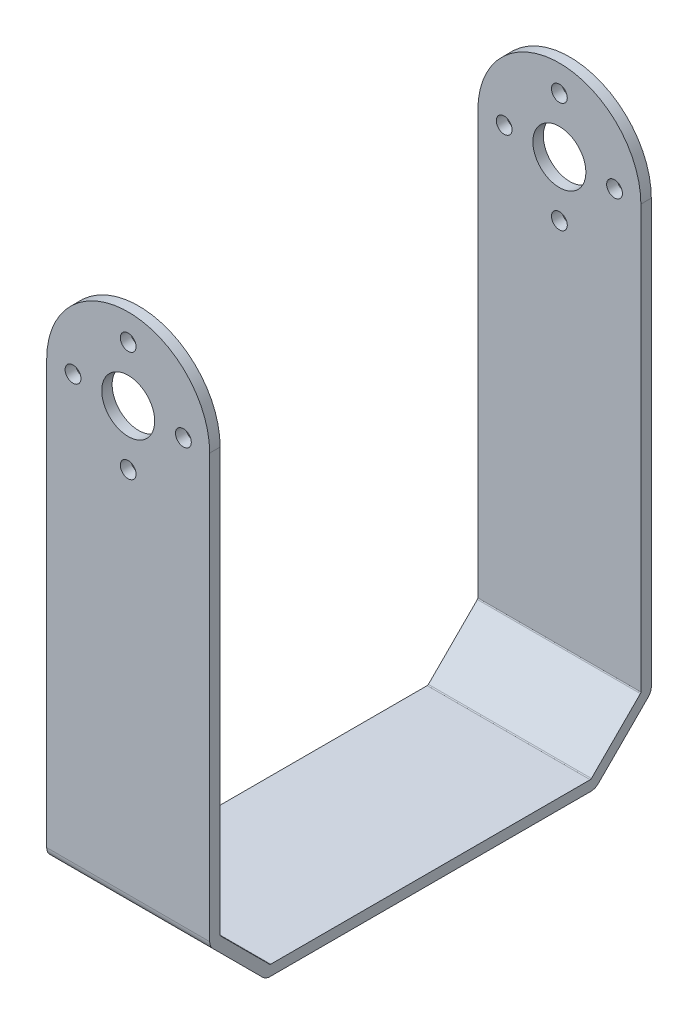
ISO-10303-21;
HEADER;
FILE_DESCRIPTION(('STEP AP214'),'2;1');
FILE_NAME('part.step','',(''),(''),'','','');
FILE_SCHEMA(('AUTOMOTIVE_DESIGN { 1 0 10303 214 1 1 1 1 }'));
ENDSEC;
DATA;
#1=APPLICATION_CONTEXT('core data for automotive mechanical design processes');
#2=APPLICATION_PROTOCOL_DEFINITION('international standard','automotive_design',2000,#1);
#3=PRODUCT_CONTEXT('',#1,'mechanical');
#4=PRODUCT('Part','Part','',(#3));
#5=PRODUCT_RELATED_PRODUCT_CATEGORY('part','',(#4));
#6=PRODUCT_DEFINITION_FORMATION('','',#4);
#7=PRODUCT_DEFINITION_CONTEXT('part definition',#1,'design');
#8=PRODUCT_DEFINITION('design','',#6,#7);
#9=PRODUCT_DEFINITION_SHAPE('','',#8);
#10=(LENGTH_UNIT() NAMED_UNIT(*) SI_UNIT(.MILLI.,.METRE.));
#11=(NAMED_UNIT(*) PLANE_ANGLE_UNIT() SI_UNIT($,.RADIAN.));
#12=(NAMED_UNIT(*) SI_UNIT($,.STERADIAN.) SOLID_ANGLE_UNIT());
#13=UNCERTAINTY_MEASURE_WITH_UNIT(LENGTH_MEASURE(1.E-05),#10,'distance_accuracy_value','');
#14=(GEOMETRIC_REPRESENTATION_CONTEXT(3) GLOBAL_UNCERTAINTY_ASSIGNED_CONTEXT((#13)) GLOBAL_UNIT_ASSIGNED_CONTEXT((#10,
#11,#12)) REPRESENTATION_CONTEXT('',''));
#15=CARTESIAN_POINT('',(0.,0.,0.));
#16=DIRECTION('',(0.,0.,1.));
#17=DIRECTION('',(1.,0.,0.));
#18=AXIS2_PLACEMENT_3D('',#15,#16,#17);
#19=CARTESIAN_POINT('',(24.6126,0.,0.));
#20=DIRECTION('',(0.,0.,-1.));
#21=DIRECTION('',(-1.,0.,0.));
#22=AXIS2_PLACEMENT_3D('',#19,#20,#21);
#23=PLANE('',#22);
#24=CARTESIAN_POINT('',(20.6375,73.025,0.));
#25=DIRECTION('',(0.,0.,1.));
#26=DIRECTION('',(1.,0.,0.));
#27=AXIS2_PLACEMENT_3D('',#24,#25,#26);
#28=CIRCLE('',#27,1.1938);
#29=CARTESIAN_POINT('',(21.8313,73.025,0.));
#30=VERTEX_POINT('',#29);
#31=EDGE_CURVE('E517',#30,#30,#28,.T.);
#32=ORIENTED_EDGE('',*,*,#31,.F.);
#33=EDGE_LOOP('',(#32));
#34=FACE_BOUND('',#33,.T.);
#35=CARTESIAN_POINT('',(12.3063,64.6938,0.));
#36=DIRECTION('',(0.,0.,1.));
#37=DIRECTION('',(1.,0.,0.));
#38=AXIS2_PLACEMENT_3D('',#35,#36,#37);
#39=CIRCLE('',#38,1.1938);
#40=CARTESIAN_POINT('',(13.5001,64.6938,0.));
#41=VERTEX_POINT('',#40);
#42=EDGE_CURVE('E420',#41,#41,#39,.T.);
#43=ORIENTED_EDGE('',*,*,#42,.F.);
#44=EDGE_LOOP('',(#43));
#45=FACE_BOUND('',#44,.T.);
#46=CARTESIAN_POINT('',(3.9751,73.025,0.));
#47=DIRECTION('',(0.,0.,1.));
#48=DIRECTION('',(1.,0.,0.));
#49=AXIS2_PLACEMENT_3D('',#46,#47,#48);
#50=CIRCLE('',#49,1.1938);
#51=CARTESIAN_POINT('',(5.1689,73.025,0.));
#52=VERTEX_POINT('',#51);
#53=EDGE_CURVE('E416',#52,#52,#50,.T.);
#54=ORIENTED_EDGE('',*,*,#53,.F.);
#55=EDGE_LOOP('',(#54));
#56=FACE_BOUND('',#55,.T.);
#57=CARTESIAN_POINT('',(12.3063,81.3562,0.));
#58=DIRECTION('',(0.,0.,1.));
#59=DIRECTION('',(1.,0.,0.));
#60=AXIS2_PLACEMENT_3D('',#57,#58,#59);
#61=CIRCLE('',#60,1.1938);
#62=CARTESIAN_POINT('',(13.5001,81.3562,0.));
#63=VERTEX_POINT('',#62);
#64=EDGE_CURVE('E440',#63,#63,#61,.T.);
#65=ORIENTED_EDGE('',*,*,#64,.F.);
#66=EDGE_LOOP('',(#65));
#67=FACE_BOUND('',#66,.T.);
#68=CARTESIAN_POINT('',(12.3063,73.025,0.));
#69=DIRECTION('',(0.,0.,1.));
#70=DIRECTION('',(1.,0.,0.));
#71=AXIS2_PLACEMENT_3D('',#68,#69,#70);
#72=CIRCLE('',#71,4.0005);
#73=CARTESIAN_POINT('',(16.3068,73.025,0.));
#74=VERTEX_POINT('',#73);
#75=EDGE_CURVE('E450',#74,#74,#72,.T.);
#76=ORIENTED_EDGE('',*,*,#75,.F.);
#77=EDGE_LOOP('',(#76));
#78=FACE_BOUND('',#77,.T.);
#79=DIRECTION('',(0.,-1.,0.));
#80=VECTOR('',#79,1.);
#81=CARTESIAN_POINT('',(0.,0.,0.));
#82=LINE('',#81,#80);
#83=CARTESIAN_POINT('',(0.,73.0123,0.));
#84=VERTEX_POINT('',#83);
#85=CARTESIAN_POINT('',(0.,9.12386051224214,0.));
#86=VERTEX_POINT('',#85);
#87=EDGE_CURVE('E249',#84,#86,#82,.T.);
#88=ORIENTED_EDGE('',*,*,#87,.T.);
#89=DIRECTION('',(1.,0.,0.));
#90=VECTOR('',#89,1.);
#91=CARTESIAN_POINT('',(24.6126,9.12386051224214,0.));
#92=LINE('',#91,#90);
#93=CARTESIAN_POINT('',(24.6126,9.12386051224214,0.));
#94=VERTEX_POINT('',#93);
#95=EDGE_CURVE('E338',#86,#94,#92,.T.);
#96=ORIENTED_EDGE('',*,*,#95,.T.);
#97=DIRECTION('',(0.,-1.,0.));
#98=VECTOR('',#97,1.);
#99=CARTESIAN_POINT('',(24.6126,0.,0.));
#100=LINE('',#99,#98);
#101=CARTESIAN_POINT('',(24.6126,73.0123,0.));
#102=VERTEX_POINT('',#101);
#103=EDGE_CURVE('E187',#102,#94,#100,.T.);
#104=ORIENTED_EDGE('',*,*,#103,.F.);
#105=CARTESIAN_POINT('',(12.3063,73.0123,0.));
#106=DIRECTION('',(0.,0.,1.));
#107=DIRECTION('',(1.,0.,0.));
#108=AXIS2_PLACEMENT_3D('',#105,#106,#107);
#109=CIRCLE('',#108,12.3063);
#110=EDGE_CURVE('E199',#102,#84,#109,.T.);
#111=ORIENTED_EDGE('',*,*,#110,.T.);
#112=EDGE_LOOP('',(#88,#96,#104,#111));
#113=FACE_BOUND('',#112,.T.);
#114=ADVANCED_FACE('F38',(#34,#45,#56,#67,#78,#113),#23,.F.);
#115=CARTESIAN_POINT('',(24.6126,0.,-66.675));
#116=DIRECTION('',(0.,0.,1.));
#117=DIRECTION('',(1.,0.,0.));
#118=AXIS2_PLACEMENT_3D('',#115,#116,#117);
#119=PLANE('',#118);
#120=CARTESIAN_POINT('',(20.6375,73.025,-66.675));
#121=DIRECTION('',(0.,0.,1.));
#122=DIRECTION('',(1.,0.,0.));
#123=AXIS2_PLACEMENT_3D('',#120,#121,#122);
#124=CIRCLE('',#123,1.1938);
#125=CARTESIAN_POINT('',(21.8313,73.025,-66.675));
#126=VERTEX_POINT('',#125);
#127=EDGE_CURVE('E513',#126,#126,#124,.T.);
#128=ORIENTED_EDGE('',*,*,#127,.T.);
#129=EDGE_LOOP('',(#128));
#130=FACE_BOUND('',#129,.T.);
#131=CARTESIAN_POINT('',(12.3063,64.6938,-66.675));
#132=DIRECTION('',(0.,0.,1.));
#133=DIRECTION('',(1.,0.,0.));
#134=AXIS2_PLACEMENT_3D('',#131,#132,#133);
#135=CIRCLE('',#134,1.1938);
#136=CARTESIAN_POINT('',(13.5001,64.6938,-66.675));
#137=VERTEX_POINT('',#136);
#138=EDGE_CURVE('E410',#137,#137,#135,.T.);
#139=ORIENTED_EDGE('',*,*,#138,.T.);
#140=EDGE_LOOP('',(#139));
#141=FACE_BOUND('',#140,.T.);
#142=CARTESIAN_POINT('',(3.9751,73.025,-66.675));
#143=DIRECTION('',(0.,0.,1.));
#144=DIRECTION('',(1.,0.,0.));
#145=AXIS2_PLACEMENT_3D('',#142,#143,#144);
#146=CIRCLE('',#145,1.1938);
#147=CARTESIAN_POINT('',(5.1689,73.025,-66.675));
#148=VERTEX_POINT('',#147);
#149=EDGE_CURVE('E405',#148,#148,#146,.T.);
#150=ORIENTED_EDGE('',*,*,#149,.T.);
#151=EDGE_LOOP('',(#150));
#152=FACE_BOUND('',#151,.T.);
#153=CARTESIAN_POINT('',(12.3063,81.3562,-66.675));
#154=DIRECTION('',(0.,0.,1.));
#155=DIRECTION('',(1.,0.,0.));
#156=AXIS2_PLACEMENT_3D('',#153,#154,#155);
#157=CIRCLE('',#156,1.1938);
#158=CARTESIAN_POINT('',(13.5001,81.3562,-66.675));
#159=VERTEX_POINT('',#158);
#160=EDGE_CURVE('E400',#159,#159,#157,.T.);
#161=ORIENTED_EDGE('',*,*,#160,.T.);
#162=EDGE_LOOP('',(#161));
#163=FACE_BOUND('',#162,.T.);
#164=CARTESIAN_POINT('',(12.3063,73.025,-66.675));
#165=DIRECTION('',(0.,0.,1.));
#166=DIRECTION('',(1.,0.,0.));
#167=AXIS2_PLACEMENT_3D('',#164,#165,#166);
#168=CIRCLE('',#167,4.0005);
#169=CARTESIAN_POINT('',(16.3068,73.025,-66.675));
#170=VERTEX_POINT('',#169);
#171=EDGE_CURVE('E394',#170,#170,#168,.T.);
#172=ORIENTED_EDGE('',*,*,#171,.T.);
#173=EDGE_LOOP('',(#172));
#174=FACE_BOUND('',#173,.T.);
#175=DIRECTION('',(0.,1.,0.));
#176=VECTOR('',#175,1.);
#177=CARTESIAN_POINT('',(24.6126,0.,-66.675));
#178=LINE('',#177,#176);
#179=CARTESIAN_POINT('',(24.6126,9.12386051224214,-66.675));
#180=VERTEX_POINT('',#179);
#181=CARTESIAN_POINT('',(24.6126,73.0123,-66.675));
#182=VERTEX_POINT('',#181);
#183=EDGE_CURVE('E281',#180,#182,#178,.T.);
#184=ORIENTED_EDGE('',*,*,#183,.F.);
#185=DIRECTION('',(1.,0.,0.));
#186=VECTOR('',#185,1.);
#187=CARTESIAN_POINT('',(0.,9.12386051224214,-66.675));
#188=LINE('',#187,#186);
#189=CARTESIAN_POINT('',(0.,9.12386051224214,-66.675));
#190=VERTEX_POINT('',#189);
#191=EDGE_CURVE('E182',#180,#190,#188,.F.);
#192=ORIENTED_EDGE('',*,*,#191,.T.);
#193=DIRECTION('',(0.,1.,0.));
#194=VECTOR('',#193,1.);
#195=CARTESIAN_POINT('',(0.,0.,-66.675));
#196=LINE('',#195,#194);
#197=CARTESIAN_POINT('',(0.,73.0123,-66.675));
#198=VERTEX_POINT('',#197);
#199=EDGE_CURVE('E176',#190,#198,#196,.T.);
#200=ORIENTED_EDGE('',*,*,#199,.T.);
#201=CARTESIAN_POINT('',(12.3063,73.0123,-66.675));
#202=DIRECTION('',(0.,0.,1.));
#203=DIRECTION('',(1.,0.,0.));
#204=AXIS2_PLACEMENT_3D('',#201,#202,#203);
#205=CIRCLE('',#204,12.3063);
#206=EDGE_CURVE('E180',#182,#198,#205,.T.);
#207=ORIENTED_EDGE('',*,*,#206,.F.);
#208=EDGE_LOOP('',(#184,#192,#200,#207));
#209=FACE_BOUND('',#208,.T.);
#210=ADVANCED_FACE('F179',(#130,#141,#152,#163,#174,#209),#119,.F.);
#211=CARTESIAN_POINT('',(0.,85.3186,-1.5748));
#212=DIRECTION('',(0.,0.,-1.));
#213=DIRECTION('',(0.,1.,0.));
#214=AXIS2_PLACEMENT_3D('',#211,#212,#213);
#215=PLANE('',#214);
#216=CARTESIAN_POINT('',(20.6375,73.025,-1.5748));
#217=DIRECTION('',(0.,0.,-1.));
#218=DIRECTION('',(0.,1.,0.));
#219=AXIS2_PLACEMENT_3D('',#216,#217,#218);
#220=CIRCLE('',#219,1.1938);
#221=CARTESIAN_POINT('',(20.6375,74.2188,-1.5748));
#222=VERTEX_POINT('',#221);
#223=EDGE_CURVE('E426',#222,#222,#220,.T.);
#224=ORIENTED_EDGE('',*,*,#223,.F.);
#225=EDGE_LOOP('',(#224));
#226=FACE_BOUND('',#225,.T.);
#227=CARTESIAN_POINT('',(12.3063,64.6938,-1.5748));
#228=DIRECTION('',(0.,0.,-1.));
#229=DIRECTION('',(0.,1.,0.));
#230=AXIS2_PLACEMENT_3D('',#227,#228,#229);
#231=CIRCLE('',#230,1.1938);
#232=CARTESIAN_POINT('',(12.3063,65.8876,-1.5748));
#233=VERTEX_POINT('',#232);
#234=EDGE_CURVE('E409',#233,#233,#231,.T.);
#235=ORIENTED_EDGE('',*,*,#234,.F.);
#236=EDGE_LOOP('',(#235));
#237=FACE_BOUND('',#236,.T.);
#238=CARTESIAN_POINT('',(3.9751,73.025,-1.5748));
#239=DIRECTION('',(0.,0.,-1.));
#240=DIRECTION('',(0.,1.,0.));
#241=AXIS2_PLACEMENT_3D('',#238,#239,#240);
#242=CIRCLE('',#241,1.1938);
#243=CARTESIAN_POINT('',(3.9751,74.2188,-1.5748));
#244=VERTEX_POINT('',#243);
#245=EDGE_CURVE('E404',#244,#244,#242,.T.);
#246=ORIENTED_EDGE('',*,*,#245,.F.);
#247=EDGE_LOOP('',(#246));
#248=FACE_BOUND('',#247,.T.);
#249=CARTESIAN_POINT('',(12.3063,81.3562,-1.5748));
#250=DIRECTION('',(0.,0.,-1.));
#251=DIRECTION('',(0.,1.,0.));
#252=AXIS2_PLACEMENT_3D('',#249,#250,#251);
#253=CIRCLE('',#252,1.1938);
#254=CARTESIAN_POINT('',(12.3063,82.55,-1.5748));
#255=VERTEX_POINT('',#254);
#256=EDGE_CURVE('E399',#255,#255,#253,.T.);
#257=ORIENTED_EDGE('',*,*,#256,.F.);
#258=EDGE_LOOP('',(#257));
#259=FACE_BOUND('',#258,.T.);
#260=CARTESIAN_POINT('',(12.3063,73.025,-1.5748));
#261=DIRECTION('',(0.,0.,-1.));
#262=DIRECTION('',(0.,1.,0.));
#263=AXIS2_PLACEMENT_3D('',#260,#261,#262);
#264=CIRCLE('',#263,4.0005);
#265=CARTESIAN_POINT('',(12.3063,77.0255,-1.5748));
#266=VERTEX_POINT('',#265);
#267=EDGE_CURVE('E393',#266,#266,#264,.T.);
#268=ORIENTED_EDGE('',*,*,#267,.F.);
#269=EDGE_LOOP('',(#268));
#270=FACE_BOUND('',#269,.T.);
#271=DIRECTION('',(0.,1.,0.));
#272=VECTOR('',#271,1.);
#273=CARTESIAN_POINT('',(24.6126,85.3186,-1.5748));
#274=LINE('',#273,#272);
#275=CARTESIAN_POINT('',(24.6126,9.22381024484277,-1.57480000000001));
#276=VERTEX_POINT('',#275);
#277=CARTESIAN_POINT('',(24.6126,73.0123,-1.5748));
#278=VERTEX_POINT('',#277);
#279=EDGE_CURVE('E228',#276,#278,#274,.T.);
#280=ORIENTED_EDGE('',*,*,#279,.F.);
#281=DIRECTION('',(1.,0.,0.));
#282=VECTOR('',#281,1.);
#283=CARTESIAN_POINT('',(0.,9.22381024484277,-1.57480000000001));
#284=LINE('',#283,#282);
#285=CARTESIAN_POINT('',(0.,9.22381024484277,-1.57480000000001));
#286=VERTEX_POINT('',#285);
#287=EDGE_CURVE('E62',#276,#286,#284,.F.);
#288=ORIENTED_EDGE('',*,*,#287,.T.);
#289=DIRECTION('',(0.,1.,0.));
#290=VECTOR('',#289,1.);
#291=CARTESIAN_POINT('',(0.,85.3186,-1.5748));
#292=LINE('',#291,#290);
#293=CARTESIAN_POINT('',(0.,73.0123,-1.5748));
#294=VERTEX_POINT('',#293);
#295=EDGE_CURVE('E246',#286,#294,#292,.T.);
#296=ORIENTED_EDGE('',*,*,#295,.T.);
#297=CARTESIAN_POINT('',(12.3063,73.0123,-1.5748));
#298=DIRECTION('',(0.,0.,-1.));
#299=DIRECTION('',(0.,1.,0.));
#300=AXIS2_PLACEMENT_3D('',#297,#298,#299);
#301=CIRCLE('',#300,12.3063);
#302=EDGE_CURVE('E218',#294,#278,#301,.T.);
#303=ORIENTED_EDGE('',*,*,#302,.T.);
#304=EDGE_LOOP('',(#280,#288,#296,#303));
#305=FACE_BOUND('',#304,.T.);
#306=ADVANCED_FACE('F475',(#226,#237,#248,#259,#270,#305),#215,.T.);
#307=CARTESIAN_POINT('',(0.,9.1186,-65.1002));
#308=DIRECTION('',(0.,0.,1.));
#309=DIRECTION('',(1.,0.,0.));
#310=AXIS2_PLACEMENT_3D('',#307,#308,#309);
#311=PLANE('',#310);
#312=CARTESIAN_POINT('',(20.6375,73.025,-65.1002));
#313=DIRECTION('',(0.,0.,1.));
#314=DIRECTION('',(1.,0.,0.));
#315=AXIS2_PLACEMENT_3D('',#312,#313,#314);
#316=CIRCLE('',#315,1.1938);
#317=CARTESIAN_POINT('',(21.8313,73.025,-65.1002));
#318=VERTEX_POINT('',#317);
#319=EDGE_CURVE('E42',#318,#318,#316,.T.);
#320=ORIENTED_EDGE('',*,*,#319,.F.);
#321=EDGE_LOOP('',(#320));
#322=FACE_BOUND('',#321,.T.);
#323=CARTESIAN_POINT('',(12.3063,64.6938,-65.1002));
#324=DIRECTION('',(0.,0.,1.));
#325=DIRECTION('',(1.,0.,0.));
#326=AXIS2_PLACEMENT_3D('',#323,#324,#325);
#327=CIRCLE('',#326,1.1938);
#328=CARTESIAN_POINT('',(13.5001,64.6938,-65.1002));
#329=VERTEX_POINT('',#328);
#330=EDGE_CURVE('E406',#329,#329,#327,.T.);
#331=ORIENTED_EDGE('',*,*,#330,.F.);
#332=EDGE_LOOP('',(#331));
#333=FACE_BOUND('',#332,.T.);
#334=CARTESIAN_POINT('',(3.9751,73.025,-65.1002));
#335=DIRECTION('',(0.,0.,1.));
#336=DIRECTION('',(1.,0.,0.));
#337=AXIS2_PLACEMENT_3D('',#334,#335,#336);
#338=CIRCLE('',#337,1.1938);
#339=CARTESIAN_POINT('',(5.1689,73.025,-65.1002));
#340=VERTEX_POINT('',#339);
#341=EDGE_CURVE('E401',#340,#340,#338,.T.);
#342=ORIENTED_EDGE('',*,*,#341,.F.);
#343=EDGE_LOOP('',(#342));
#344=FACE_BOUND('',#343,.T.);
#345=CARTESIAN_POINT('',(12.3063,81.3562,-65.1002));
#346=DIRECTION('',(0.,0.,1.));
#347=DIRECTION('',(1.,0.,0.));
#348=AXIS2_PLACEMENT_3D('',#345,#346,#347);
#349=CIRCLE('',#348,1.1938);
#350=CARTESIAN_POINT('',(13.5001,81.3562,-65.1002));
#351=VERTEX_POINT('',#350);
#352=EDGE_CURVE('E395',#351,#351,#349,.T.);
#353=ORIENTED_EDGE('',*,*,#352,.F.);
#354=EDGE_LOOP('',(#353));
#355=FACE_BOUND('',#354,.T.);
#356=CARTESIAN_POINT('',(12.3063,73.025,-65.1002));
#357=DIRECTION('',(0.,0.,1.));
#358=DIRECTION('',(1.,0.,0.));
#359=AXIS2_PLACEMENT_3D('',#356,#357,#358);
#360=CIRCLE('',#359,4.0005);
#361=CARTESIAN_POINT('',(16.3068,73.025,-65.1002));
#362=VERTEX_POINT('',#361);
#363=EDGE_CURVE('E389',#362,#362,#360,.T.);
#364=ORIENTED_EDGE('',*,*,#363,.F.);
#365=EDGE_LOOP('',(#364));
#366=FACE_BOUND('',#365,.T.);
#367=DIRECTION('',(0.,-1.,0.));
#368=VECTOR('',#367,1.);
#369=CARTESIAN_POINT('',(0.,9.1186,-65.1002));
#370=LINE('',#369,#368);
#371=CARTESIAN_POINT('',(0.,73.0123,-65.1002));
#372=VERTEX_POINT('',#371);
#373=CARTESIAN_POINT('',(0.,9.22381024484276,-65.1002));
#374=VERTEX_POINT('',#373);
#375=EDGE_CURVE('E205',#372,#374,#370,.T.);
#376=ORIENTED_EDGE('',*,*,#375,.T.);
#377=DIRECTION('',(1.,0.,0.));
#378=VECTOR('',#377,1.);
#379=CARTESIAN_POINT('',(24.6126,9.22381024484276,-65.1002));
#380=LINE('',#379,#378);
#381=CARTESIAN_POINT('',(24.6126,9.22381024484276,-65.1002));
#382=VERTEX_POINT('',#381);
#383=EDGE_CURVE('E342',#374,#382,#380,.T.);
#384=ORIENTED_EDGE('',*,*,#383,.T.);
#385=DIRECTION('',(0.,-1.,0.));
#386=VECTOR('',#385,1.);
#387=CARTESIAN_POINT('',(24.6126,9.1186,-65.1002));
#388=LINE('',#387,#386);
#389=CARTESIAN_POINT('',(24.6126,73.0123,-65.1002));
#390=VERTEX_POINT('',#389);
#391=EDGE_CURVE('E257',#390,#382,#388,.T.);
#392=ORIENTED_EDGE('',*,*,#391,.F.);
#393=CARTESIAN_POINT('',(12.3063,73.0123,-65.1002));
#394=DIRECTION('',(0.,0.,1.));
#395=DIRECTION('',(1.,0.,0.));
#396=AXIS2_PLACEMENT_3D('',#393,#394,#395);
#397=CIRCLE('',#396,12.3063);
#398=EDGE_CURVE('E284',#390,#372,#397,.T.);
#399=ORIENTED_EDGE('',*,*,#398,.T.);
#400=EDGE_LOOP('',(#376,#384,#392,#399));
#401=FACE_BOUND('',#400,.T.);
#402=ADVANCED_FACE('F508',(#322,#333,#344,#355,#366,#401),#311,.T.);
#403=CARTESIAN_POINT('',(24.6126,0.,0.));
#404=DIRECTION('',(0.,1.,0.));
#405=DIRECTION('',(0.,0.,1.));
#406=AXIS2_PLACEMENT_3D('',#403,#404,#405);
#407=PLANE('',#406);
#408=DIRECTION('',(0.,0.,-1.));
#409=VECTOR('',#408,1.);
#410=CARTESIAN_POINT('',(0.,0.,0.));
#411=LINE('',#410,#409);
#412=CARTESIAN_POINT('',(0.,0.,-9.12386051224214));
#413=VERTEX_POINT('',#412);
#414=CARTESIAN_POINT('',(0.,0.,-57.5511394877579));
#415=VERTEX_POINT('',#414);
#416=EDGE_CURVE('E188',#413,#415,#411,.T.);
#417=ORIENTED_EDGE('',*,*,#416,.T.);
#418=DIRECTION('',(1.,0.,0.));
#419=VECTOR('',#418,1.);
#420=CARTESIAN_POINT('',(24.6126,0.,-57.5511394877579));
#421=LINE('',#420,#419);
#422=CARTESIAN_POINT('',(24.6126,0.,-57.5511394877579));
#423=VERTEX_POINT('',#422);
#424=EDGE_CURVE('E296',#415,#423,#421,.T.);
#425=ORIENTED_EDGE('',*,*,#424,.T.);
#426=DIRECTION('',(0.,0.,-1.));
#427=VECTOR('',#426,1.);
#428=CARTESIAN_POINT('',(24.6126,0.,0.));
#429=LINE('',#428,#427);
#430=CARTESIAN_POINT('',(24.6126,0.,-9.12386051224214));
#431=VERTEX_POINT('',#430);
#432=EDGE_CURVE('E277',#431,#423,#429,.T.);
#433=ORIENTED_EDGE('',*,*,#432,.F.);
#434=DIRECTION('',(1.,0.,0.));
#435=VECTOR('',#434,1.);
#436=CARTESIAN_POINT('',(0.,0.,-9.12386051224214));
#437=LINE('',#436,#435);
#438=EDGE_CURVE('E293',#431,#413,#437,.F.);
#439=ORIENTED_EDGE('',*,*,#438,.T.);
#440=EDGE_LOOP('',(#417,#425,#433,#439));
#441=FACE_BOUND('',#440,.T.);
#442=ADVANCED_FACE('F567',(#441),#407,.F.);
#443=CARTESIAN_POINT('',(24.6126,85.3186,0.));
#444=DIRECTION('',(-1.,0.,0.));
#445=DIRECTION('',(0.,0.,1.));
#446=AXIS2_PLACEMENT_3D('',#443,#444,#445);
#447=PLANE('',#446);
#448=ORIENTED_EDGE('',*,*,#432,.T.);
#449=CARTESIAN_POINT('',(24.6126,1.5875,-57.5511394877579));
#450=DIRECTION('',(-1.,0.,0.));
#451=DIRECTION('',(0.,0.,1.));
#452=AXIS2_PLACEMENT_3D('',#449,#450,#451);
#453=CIRCLE('',#452,1.5875);
#454=CARTESIAN_POINT('',(24.6126,0.464967984866358,-58.6736715028915));
#455=VERTEX_POINT('',#454);
#456=EDGE_CURVE('E308',#423,#455,#453,.F.);
#457=ORIENTED_EDGE('',*,*,#456,.T.);
#458=DIRECTION('',(0.,0.707106781186548,-0.707106781186547));
#459=VECTOR('',#458,1.);
#460=CARTESIAN_POINT('',(24.6126,0.,-58.2087035180252));
#461=LINE('',#460,#459);
#462=CARTESIAN_POINT('',(24.6126,8.00132849710849,-66.2100320151336));
#463=VERTEX_POINT('',#462);
#464=EDGE_CURVE('E253',#455,#463,#461,.T.);
#465=ORIENTED_EDGE('',*,*,#464,.T.);
#466=CARTESIAN_POINT('',(24.6126,9.12386051224214,-65.0875));
#467=DIRECTION('',(-1.,0.,0.));
#468=DIRECTION('',(0.,0.,1.));
#469=AXIS2_PLACEMENT_3D('',#466,#467,#468);
#470=CIRCLE('',#469,1.5875);
#471=EDGE_CURVE('E305',#463,#180,#470,.F.);
#472=ORIENTED_EDGE('',*,*,#471,.T.);
#473=ORIENTED_EDGE('',*,*,#183,.T.);
#474=DIRECTION('',(0.,0.,1.));
#475=VECTOR('',#474,1.);
#476=CARTESIAN_POINT('',(24.6126,73.0123,-66.675));
#477=LINE('',#476,#475);
#478=EDGE_CURVE('E196',#182,#390,#477,.T.);
#479=ORIENTED_EDGE('',*,*,#478,.T.);
#480=ORIENTED_EDGE('',*,*,#391,.T.);
#481=CARTESIAN_POINT('',(24.6126,9.22381024484276,-64.8462));
#482=DIRECTION('',(-1.,0.,0.));
#483=DIRECTION('',(0.,0.,1.));
#484=AXIS2_PLACEMENT_3D('',#481,#482,#483);
#485=CIRCLE('',#484,0.254);
#486=CARTESIAN_POINT('',(24.6126,9.04420512242137,-65.0258051224214));
#487=VERTEX_POINT('',#486);
#488=EDGE_CURVE('E369',#382,#487,#485,.T.);
#489=ORIENTED_EDGE('',*,*,#488,.T.);
#490=DIRECTION('',(0.,-0.707106781186548,0.707106781186547));
#491=VECTOR('',#490,1.);
#492=CARTESIAN_POINT('',(24.6126,9.1186,-65.1002));
#493=LINE('',#492,#491);
#494=CARTESIAN_POINT('',(24.6126,1.64919487757862,-57.6307948775786));
#495=VERTEX_POINT('',#494);
#496=EDGE_CURVE('E261',#487,#495,#493,.T.);
#497=ORIENTED_EDGE('',*,*,#496,.T.);
#498=CARTESIAN_POINT('',(24.6126,1.8288,-57.4511897551572));
#499=DIRECTION('',(-1.,0.,0.));
#500=DIRECTION('',(0.,0.,1.));
#501=AXIS2_PLACEMENT_3D('',#498,#499,#500);
#502=CIRCLE('',#501,0.254);
#503=CARTESIAN_POINT('',(24.6126,1.5748,-57.4511897551572));
#504=VERTEX_POINT('',#503);
#505=EDGE_CURVE('E375',#495,#504,#502,.T.);
#506=ORIENTED_EDGE('',*,*,#505,.T.);
#507=DIRECTION('',(0.,0.,1.));
#508=VECTOR('',#507,1.);
#509=CARTESIAN_POINT('',(24.6126,1.5748,-9.1186));
#510=LINE('',#509,#508);
#511=CARTESIAN_POINT('',(24.6126,1.5748,-9.22381024484277));
#512=VERTEX_POINT('',#511);
#513=EDGE_CURVE('E265',#504,#512,#510,.T.);
#514=ORIENTED_EDGE('',*,*,#513,.T.);
#515=CARTESIAN_POINT('',(24.6126,1.8288,-9.22381024484277));
#516=DIRECTION('',(-1.,0.,0.));
#517=DIRECTION('',(0.,0.,1.));
#518=AXIS2_PLACEMENT_3D('',#515,#516,#517);
#519=CIRCLE('',#518,0.254);
#520=CARTESIAN_POINT('',(24.6126,1.64919487757862,-9.04420512242138));
#521=VERTEX_POINT('',#520);
#522=EDGE_CURVE('E381',#512,#521,#519,.T.);
#523=ORIENTED_EDGE('',*,*,#522,.T.);
#524=DIRECTION('',(0.,0.707106781186548,0.707106781186547));
#525=VECTOR('',#524,1.);
#526=CARTESIAN_POINT('',(24.6126,9.1186,-1.57480000000001));
#527=LINE('',#526,#525);
#528=CARTESIAN_POINT('',(24.6126,9.04420512242138,-1.64919487757862));
#529=VERTEX_POINT('',#528);
#530=EDGE_CURVE('E269',#521,#529,#527,.T.);
#531=ORIENTED_EDGE('',*,*,#530,.T.);
#532=CARTESIAN_POINT('',(24.6126,9.22381024484277,-1.82880000000001));
#533=DIRECTION('',(-1.,0.,0.));
#534=DIRECTION('',(0.,0.,1.));
#535=AXIS2_PLACEMENT_3D('',#532,#533,#534);
#536=CIRCLE('',#535,0.254);
#537=EDGE_CURVE('E48',#529,#276,#536,.T.);
#538=ORIENTED_EDGE('',*,*,#537,.T.);
#539=ORIENTED_EDGE('',*,*,#279,.T.);
#540=EDGE_CURVE('E207',#278,#102,#477,.T.);
#541=ORIENTED_EDGE('',*,*,#540,.T.);
#542=ORIENTED_EDGE('',*,*,#103,.T.);
#543=CARTESIAN_POINT('',(24.6126,9.12386051224214,-1.5875));
#544=DIRECTION('',(-1.,0.,0.));
#545=DIRECTION('',(0.,0.,1.));
#546=AXIS2_PLACEMENT_3D('',#543,#544,#545);
#547=CIRCLE('',#546,1.5875);
#548=CARTESIAN_POINT('',(24.6126,8.00132849710849,-0.464967984866355));
#549=VERTEX_POINT('',#548);
#550=EDGE_CURVE('E300',#94,#549,#547,.F.);
#551=ORIENTED_EDGE('',*,*,#550,.T.);
#552=DIRECTION('',(0.,-0.707106781186547,-0.707106781186548));
#553=VECTOR('',#552,1.);
#554=CARTESIAN_POINT('',(24.6126,8.46629648197485,0.));
#555=LINE('',#554,#553);
#556=CARTESIAN_POINT('',(24.6126,0.464967984866357,-8.00132849710849));
#557=VERTEX_POINT('',#556);
#558=EDGE_CURVE('E222',#549,#557,#555,.T.);
#559=ORIENTED_EDGE('',*,*,#558,.T.);
#560=CARTESIAN_POINT('',(24.6126,1.5875,-9.12386051224214));
#561=DIRECTION('',(-1.,0.,0.));
#562=DIRECTION('',(0.,0.,1.));
#563=AXIS2_PLACEMENT_3D('',#560,#561,#562);
#564=CIRCLE('',#563,1.5875);
#565=EDGE_CURVE('E303',#557,#431,#564,.F.);
#566=ORIENTED_EDGE('',*,*,#565,.T.);
#567=EDGE_LOOP('',(#448,#457,#465,#472,#473,#479,#480,#489,#497,#506,#514,#523,#531,#538,#539,
#541,#542,#551,#559,#566));
#568=FACE_BOUND('',#567,.T.);
#569=ADVANCED_FACE('F473',(#568),#447,.F.);
#570=CARTESIAN_POINT('',(0.,85.3186,0.));
#571=DIRECTION('',(-1.,0.,0.));
#572=DIRECTION('',(0.,0.,1.));
#573=AXIS2_PLACEMENT_3D('',#570,#571,#572);
#574=PLANE('',#573);
#575=DIRECTION('',(0.,0.707106781186548,-0.707106781186547));
#576=VECTOR('',#575,1.);
#577=CARTESIAN_POINT('',(0.,0.,-58.2087035180252));
#578=LINE('',#577,#576);
#579=CARTESIAN_POINT('',(0.,0.464967984866358,-58.6736715028915));
#580=VERTEX_POINT('',#579);
#581=CARTESIAN_POINT('',(0.,8.00132849710849,-66.2100320151336));
#582=VERTEX_POINT('',#581);
#583=EDGE_CURVE('E227',#580,#582,#578,.T.);
#584=ORIENTED_EDGE('',*,*,#583,.F.);
#585=CARTESIAN_POINT('',(0.,1.5875,-57.5511394877579));
#586=DIRECTION('',(-1.,0.,0.));
#587=DIRECTION('',(0.,0.,1.));
#588=AXIS2_PLACEMENT_3D('',#585,#586,#587);
#589=CIRCLE('',#588,1.5875);
#590=EDGE_CURVE('E327',#580,#415,#589,.T.);
#591=ORIENTED_EDGE('',*,*,#590,.T.);
#592=ORIENTED_EDGE('',*,*,#416,.F.);
#593=CARTESIAN_POINT('',(0.,1.5875,-9.12386051224214));
#594=DIRECTION('',(-1.,0.,0.));
#595=DIRECTION('',(0.,0.,1.));
#596=AXIS2_PLACEMENT_3D('',#593,#594,#595);
#597=CIRCLE('',#596,1.5875);
#598=CARTESIAN_POINT('',(0.,0.464967984866357,-8.00132849710849));
#599=VERTEX_POINT('',#598);
#600=EDGE_CURVE('E321',#413,#599,#597,.T.);
#601=ORIENTED_EDGE('',*,*,#600,.T.);
#602=DIRECTION('',(0.,-0.707106781186547,-0.707106781186548));
#603=VECTOR('',#602,1.);
#604=CARTESIAN_POINT('',(0.,8.46629648197485,0.));
#605=LINE('',#604,#603);
#606=CARTESIAN_POINT('',(0.,8.00132849710849,-0.464967984866355));
#607=VERTEX_POINT('',#606);
#608=EDGE_CURVE('E223',#607,#599,#605,.T.);
#609=ORIENTED_EDGE('',*,*,#608,.F.);
#610=CARTESIAN_POINT('',(0.,9.12386051224214,-1.5875));
#611=DIRECTION('',(-1.,0.,0.));
#612=DIRECTION('',(0.,0.,1.));
#613=AXIS2_PLACEMENT_3D('',#610,#611,#612);
#614=CIRCLE('',#613,1.5875);
#615=EDGE_CURVE('E318',#607,#86,#614,.T.);
#616=ORIENTED_EDGE('',*,*,#615,.T.);
#617=ORIENTED_EDGE('',*,*,#87,.F.);
#618=DIRECTION('',(0.,0.,1.));
#619=VECTOR('',#618,1.);
#620=CARTESIAN_POINT('',(0.,73.0123,-66.675));
#621=LINE('',#620,#619);
#622=EDGE_CURVE('E198',#294,#84,#621,.T.);
#623=ORIENTED_EDGE('',*,*,#622,.F.);
#624=ORIENTED_EDGE('',*,*,#295,.F.);
#625=CARTESIAN_POINT('',(0.,9.22381024484277,-1.82880000000001));
#626=DIRECTION('',(-1.,0.,0.));
#627=DIRECTION('',(0.,0.,1.));
#628=AXIS2_PLACEMENT_3D('',#625,#626,#627);
#629=CIRCLE('',#628,0.254);
#630=CARTESIAN_POINT('',(0.,9.04420512242138,-1.64919487757862));
#631=VERTEX_POINT('',#630);
#632=EDGE_CURVE('E12',#286,#631,#629,.F.);
#633=ORIENTED_EDGE('',*,*,#632,.T.);
#634=DIRECTION('',(0.,0.707106781186548,0.707106781186547));
#635=VECTOR('',#634,1.);
#636=CARTESIAN_POINT('',(0.,9.1186,-1.57480000000001));
#637=LINE('',#636,#635);
#638=CARTESIAN_POINT('',(0.,1.64919487757862,-9.04420512242138));
#639=VERTEX_POINT('',#638);
#640=EDGE_CURVE('E242',#639,#631,#637,.T.);
#641=ORIENTED_EDGE('',*,*,#640,.F.);
#642=CARTESIAN_POINT('',(0.,1.8288,-9.22381024484277));
#643=DIRECTION('',(-1.,0.,0.));
#644=DIRECTION('',(0.,0.,1.));
#645=AXIS2_PLACEMENT_3D('',#642,#643,#644);
#646=CIRCLE('',#645,0.254);
#647=CARTESIAN_POINT('',(0.,1.5748,-9.22381024484277));
#648=VERTEX_POINT('',#647);
#649=EDGE_CURVE('E384',#639,#648,#646,.F.);
#650=ORIENTED_EDGE('',*,*,#649,.T.);
#651=DIRECTION('',(0.,0.,1.));
#652=VECTOR('',#651,1.);
#653=CARTESIAN_POINT('',(0.,1.5748,-9.1186));
#654=LINE('',#653,#652);
#655=CARTESIAN_POINT('',(0.,1.5748,-57.4511897551572));
#656=VERTEX_POINT('',#655);
#657=EDGE_CURVE('E238',#656,#648,#654,.T.);
#658=ORIENTED_EDGE('',*,*,#657,.F.);
#659=CARTESIAN_POINT('',(0.,1.8288,-57.4511897551572));
#660=DIRECTION('',(-1.,0.,0.));
#661=DIRECTION('',(0.,0.,1.));
#662=AXIS2_PLACEMENT_3D('',#659,#660,#661);
#663=CIRCLE('',#662,0.254);
#664=CARTESIAN_POINT('',(0.,1.64919487757862,-57.6307948775786));
#665=VERTEX_POINT('',#664);
#666=EDGE_CURVE('E378',#656,#665,#663,.F.);
#667=ORIENTED_EDGE('',*,*,#666,.T.);
#668=DIRECTION('',(0.,-0.707106781186548,0.707106781186547));
#669=VECTOR('',#668,1.);
#670=CARTESIAN_POINT('',(0.,9.1186,-65.1002));
#671=LINE('',#670,#669);
#672=CARTESIAN_POINT('',(0.,9.04420512242137,-65.0258051224214));
#673=VERTEX_POINT('',#672);
#674=EDGE_CURVE('E234',#673,#665,#671,.T.);
#675=ORIENTED_EDGE('',*,*,#674,.F.);
#676=CARTESIAN_POINT('',(0.,9.22381024484276,-64.8462));
#677=DIRECTION('',(-1.,0.,0.));
#678=DIRECTION('',(0.,0.,1.));
#679=AXIS2_PLACEMENT_3D('',#676,#677,#678);
#680=CIRCLE('',#679,0.254);
#681=EDGE_CURVE('E372',#673,#374,#680,.F.);
#682=ORIENTED_EDGE('',*,*,#681,.T.);
#683=ORIENTED_EDGE('',*,*,#375,.F.);
#684=EDGE_CURVE('E193',#198,#372,#621,.T.);
#685=ORIENTED_EDGE('',*,*,#684,.F.);
#686=ORIENTED_EDGE('',*,*,#199,.F.);
#687=CARTESIAN_POINT('',(0.,9.12386051224214,-65.0875));
#688=DIRECTION('',(-1.,0.,0.));
#689=DIRECTION('',(0.,0.,1.));
#690=AXIS2_PLACEMENT_3D('',#687,#688,#689);
#691=CIRCLE('',#690,1.5875);
#692=EDGE_CURVE('E324',#190,#582,#691,.T.);
#693=ORIENTED_EDGE('',*,*,#692,.T.);
#694=EDGE_LOOP('',(#584,#591,#592,#601,#609,#616,#617,#623,#624,#633,#641,#650,#658,#667,#675,
#682,#683,#685,#686,#693));
#695=FACE_BOUND('',#694,.T.);
#696=ADVANCED_FACE('F203',(#695),#574,.T.);
#697=CARTESIAN_POINT('',(0.,8.46629648197485,0.));
#698=DIRECTION('',(0.,-0.707106781186548,0.707106781186547));
#699=DIRECTION('',(0.,-0.707106781186547,-0.707106781186548));
#700=AXIS2_PLACEMENT_3D('',#697,#698,#699);
#701=PLANE('',#700);
#702=ORIENTED_EDGE('',*,*,#608,.T.);
#703=DIRECTION('',(1.,0.,0.));
#704=VECTOR('',#703,1.);
#705=CARTESIAN_POINT('',(24.6126,0.464967984866357,-8.0013284971085));
#706=LINE('',#705,#704);
#707=EDGE_CURVE('E335',#599,#557,#706,.T.);
#708=ORIENTED_EDGE('',*,*,#707,.T.);
#709=ORIENTED_EDGE('',*,*,#558,.F.);
#710=DIRECTION('',(1.,0.,0.));
#711=VECTOR('',#710,1.);
#712=CARTESIAN_POINT('',(0.,8.00132849710849,-0.464967984866355));
#713=LINE('',#712,#711);
#714=EDGE_CURVE('E332',#549,#607,#713,.F.);
#715=ORIENTED_EDGE('',*,*,#714,.T.);
#716=EDGE_LOOP('',(#702,#708,#709,#715));
#717=FACE_BOUND('',#716,.T.);
#718=ADVANCED_FACE('F571',(#717),#701,.T.);
#719=CARTESIAN_POINT('',(0.,0.,-58.2087035180252));
#720=DIRECTION('',(0.,-0.707106781186547,-0.707106781186548));
#721=DIRECTION('',(0.,0.707106781186548,-0.707106781186547));
#722=AXIS2_PLACEMENT_3D('',#719,#720,#721);
#723=PLANE('',#722);
#724=ORIENTED_EDGE('',*,*,#464,.F.);
#725=DIRECTION('',(1.,0.,0.));
#726=VECTOR('',#725,1.);
#727=CARTESIAN_POINT('',(0.,0.464967984866357,-58.6736715028915));
#728=LINE('',#727,#726);
#729=EDGE_CURVE('E315',#455,#580,#728,.F.);
#730=ORIENTED_EDGE('',*,*,#729,.T.);
#731=ORIENTED_EDGE('',*,*,#583,.T.);
#732=DIRECTION('',(1.,0.,0.));
#733=VECTOR('',#732,1.);
#734=CARTESIAN_POINT('',(24.6126,8.00132849710849,-66.2100320151336));
#735=LINE('',#734,#733);
#736=EDGE_CURVE('E311',#582,#463,#735,.T.);
#737=ORIENTED_EDGE('',*,*,#736,.T.);
#738=EDGE_LOOP('',(#724,#730,#731,#737));
#739=FACE_BOUND('',#738,.T.);
#740=ADVANCED_FACE('F560',(#739),#723,.T.);
#741=CARTESIAN_POINT('',(0.,9.1186,-1.57480000000001));
#742=DIRECTION('',(0.,0.707106781186547,-0.707106781186548));
#743=DIRECTION('',(0.,0.707106781186548,0.707106781186547));
#744=AXIS2_PLACEMENT_3D('',#741,#742,#743);
#745=PLANE('',#744);
#746=ORIENTED_EDGE('',*,*,#530,.F.);
#747=DIRECTION('',(1.,0.,0.));
#748=VECTOR('',#747,1.);
#749=CARTESIAN_POINT('',(0.,1.64919487757862,-9.04420512242138));
#750=LINE('',#749,#748);
#751=EDGE_CURVE('E364',#521,#639,#750,.F.);
#752=ORIENTED_EDGE('',*,*,#751,.T.);
#753=ORIENTED_EDGE('',*,*,#640,.T.);
#754=DIRECTION('',(1.,0.,0.));
#755=VECTOR('',#754,1.);
#756=CARTESIAN_POINT('',(24.6126,9.04420512242138,-1.64919487757862));
#757=LINE('',#756,#755);
#758=EDGE_CURVE('E360',#631,#529,#757,.T.);
#759=ORIENTED_EDGE('',*,*,#758,.T.);
#760=EDGE_LOOP('',(#746,#752,#753,#759));
#761=FACE_BOUND('',#760,.T.);
#762=ADVANCED_FACE('F482',(#761),#745,.T.);
#763=CARTESIAN_POINT('',(0.,1.5748,-9.1186));
#764=DIRECTION('',(0.,1.,0.));
#765=DIRECTION('',(0.,0.,1.));
#766=AXIS2_PLACEMENT_3D('',#763,#764,#765);
#767=PLANE('',#766);
#768=ORIENTED_EDGE('',*,*,#513,.F.);
#769=DIRECTION('',(1.,0.,0.));
#770=VECTOR('',#769,1.);
#771=CARTESIAN_POINT('',(0.,1.5748,-57.4511897551572));
#772=LINE('',#771,#770);
#773=EDGE_CURVE('E357',#504,#656,#772,.F.);
#774=ORIENTED_EDGE('',*,*,#773,.T.);
#775=ORIENTED_EDGE('',*,*,#657,.T.);
#776=DIRECTION('',(1.,0.,0.));
#777=VECTOR('',#776,1.);
#778=CARTESIAN_POINT('',(24.6126,1.5748,-9.22381024484277));
#779=LINE('',#778,#777);
#780=EDGE_CURVE('E353',#648,#512,#779,.T.);
#781=ORIENTED_EDGE('',*,*,#780,.T.);
#782=EDGE_LOOP('',(#768,#774,#775,#781));
#783=FACE_BOUND('',#782,.T.);
#784=ADVANCED_FACE('F490',(#783),#767,.T.);
#785=CARTESIAN_POINT('',(0.,9.1186,-65.1002));
#786=DIRECTION('',(0.,0.707106781186547,0.707106781186548));
#787=DIRECTION('',(0.,-0.707106781186548,0.707106781186547));
#788=AXIS2_PLACEMENT_3D('',#785,#786,#787);
#789=PLANE('',#788);
#790=ORIENTED_EDGE('',*,*,#496,.F.);
#791=DIRECTION('',(1.,0.,0.));
#792=VECTOR('',#791,1.);
#793=CARTESIAN_POINT('',(0.,9.04420512242137,-65.0258051224214));
#794=LINE('',#793,#792);
#795=EDGE_CURVE('E350',#487,#673,#794,.F.);
#796=ORIENTED_EDGE('',*,*,#795,.T.);
#797=ORIENTED_EDGE('',*,*,#674,.T.);
#798=DIRECTION('',(1.,0.,0.));
#799=VECTOR('',#798,1.);
#800=CARTESIAN_POINT('',(24.6126,1.64919487757862,-57.6307948775786));
#801=LINE('',#800,#799);
#802=EDGE_CURVE('E346',#665,#495,#801,.T.);
#803=ORIENTED_EDGE('',*,*,#802,.T.);
#804=EDGE_LOOP('',(#790,#796,#797,#803));
#805=FACE_BOUND('',#804,.T.);
#806=ADVANCED_FACE('F500',(#805),#789,.T.);
#807=CARTESIAN_POINT('',(12.3063,73.0123,-66.675));
#808=DIRECTION('',(0.,0.,1.));
#809=DIRECTION('',(1.,0.,0.));
#810=AXIS2_PLACEMENT_3D('',#807,#808,#809);
#811=CYLINDRICAL_SURFACE('',#810,12.3063);
#812=ORIENTED_EDGE('',*,*,#206,.T.);
#813=ORIENTED_EDGE('',*,*,#684,.T.);
#814=ORIENTED_EDGE('',*,*,#398,.F.);
#815=ORIENTED_EDGE('',*,*,#478,.F.);
#816=EDGE_LOOP('',(#812,#813,#814,#815));
#817=FACE_BOUND('',#816,.T.);
#818=ADVANCED_FACE('F192',(#817),#811,.T.);
#819=ORIENTED_EDGE('',*,*,#302,.F.);
#820=ORIENTED_EDGE('',*,*,#622,.T.);
#821=ORIENTED_EDGE('',*,*,#110,.F.);
#822=ORIENTED_EDGE('',*,*,#540,.F.);
#823=EDGE_LOOP('',(#819,#820,#821,#822));
#824=FACE_BOUND('',#823,.T.);
#825=ADVANCED_FACE('F467',(#824),#811,.T.);
#826=CARTESIAN_POINT('',(24.6126,1.5875,-57.5511394877579));
#827=DIRECTION('',(-1.,0.,0.));
#828=DIRECTION('',(0.,0.,1.));
#829=AXIS2_PLACEMENT_3D('',#826,#827,#828);
#830=CYLINDRICAL_SURFACE('',#829,1.5875);
#831=ORIENTED_EDGE('',*,*,#590,.F.);
#832=ORIENTED_EDGE('',*,*,#729,.F.);
#833=ORIENTED_EDGE('',*,*,#456,.F.);
#834=ORIENTED_EDGE('',*,*,#424,.F.);
#835=EDGE_LOOP('',(#831,#832,#833,#834));
#836=FACE_BOUND('',#835,.T.);
#837=ADVANCED_FACE('F554',(#836),#830,.T.);
#838=CARTESIAN_POINT('',(0.,9.12386051224214,-65.0875));
#839=DIRECTION('',(-1.,0.,0.));
#840=DIRECTION('',(0.,0.,1.));
#841=AXIS2_PLACEMENT_3D('',#838,#839,#840);
#842=CYLINDRICAL_SURFACE('',#841,1.5875);
#843=ORIENTED_EDGE('',*,*,#692,.F.);
#844=ORIENTED_EDGE('',*,*,#191,.F.);
#845=ORIENTED_EDGE('',*,*,#471,.F.);
#846=ORIENTED_EDGE('',*,*,#736,.F.);
#847=EDGE_LOOP('',(#843,#844,#845,#846));
#848=FACE_BOUND('',#847,.T.);
#849=ADVANCED_FACE('F588',(#848),#842,.T.);
#850=CARTESIAN_POINT('',(0.,1.5875,-9.12386051224214));
#851=DIRECTION('',(-1.,0.,0.));
#852=DIRECTION('',(0.,0.,1.));
#853=AXIS2_PLACEMENT_3D('',#850,#851,#852);
#854=CYLINDRICAL_SURFACE('',#853,1.5875);
#855=ORIENTED_EDGE('',*,*,#600,.F.);
#856=ORIENTED_EDGE('',*,*,#438,.F.);
#857=ORIENTED_EDGE('',*,*,#565,.F.);
#858=ORIENTED_EDGE('',*,*,#707,.F.);
#859=EDGE_LOOP('',(#855,#856,#857,#858));
#860=FACE_BOUND('',#859,.T.);
#861=ADVANCED_FACE('F592',(#860),#854,.T.);
#862=CARTESIAN_POINT('',(24.6126,9.12386051224214,-1.5875));
#863=DIRECTION('',(-1.,0.,0.));
#864=DIRECTION('',(0.,0.,1.));
#865=AXIS2_PLACEMENT_3D('',#862,#863,#864);
#866=CYLINDRICAL_SURFACE('',#865,1.5875);
#867=ORIENTED_EDGE('',*,*,#615,.F.);
#868=ORIENTED_EDGE('',*,*,#714,.F.);
#869=ORIENTED_EDGE('',*,*,#550,.F.);
#870=ORIENTED_EDGE('',*,*,#95,.F.);
#871=EDGE_LOOP('',(#867,#868,#869,#870));
#872=FACE_BOUND('',#871,.T.);
#873=ADVANCED_FACE('F472',(#872),#866,.T.);
#874=CARTESIAN_POINT('',(0.,9.22381024484276,-64.8462));
#875=DIRECTION('',(-1.,0.,0.));
#876=DIRECTION('',(0.,0.,1.));
#877=AXIS2_PLACEMENT_3D('',#874,#875,#876);
#878=CYLINDRICAL_SURFACE('',#877,0.254);
#879=ORIENTED_EDGE('',*,*,#681,.F.);
#880=ORIENTED_EDGE('',*,*,#795,.F.);
#881=ORIENTED_EDGE('',*,*,#488,.F.);
#882=ORIENTED_EDGE('',*,*,#383,.F.);
#883=EDGE_LOOP('',(#879,#880,#881,#882));
#884=FACE_BOUND('',#883,.T.);
#885=ADVANCED_FACE('F506',(#884),#878,.F.);
#886=CARTESIAN_POINT('',(0.,1.8288,-57.4511897551572));
#887=DIRECTION('',(-1.,0.,0.));
#888=DIRECTION('',(0.,0.,1.));
#889=AXIS2_PLACEMENT_3D('',#886,#887,#888);
#890=CYLINDRICAL_SURFACE('',#889,0.254);
#891=ORIENTED_EDGE('',*,*,#666,.F.);
#892=ORIENTED_EDGE('',*,*,#773,.F.);
#893=ORIENTED_EDGE('',*,*,#505,.F.);
#894=ORIENTED_EDGE('',*,*,#802,.F.);
#895=EDGE_LOOP('',(#891,#892,#893,#894));
#896=FACE_BOUND('',#895,.T.);
#897=ADVANCED_FACE('F497',(#896),#890,.F.);
#898=CARTESIAN_POINT('',(0.,1.8288,-9.22381024484277));
#899=DIRECTION('',(-1.,0.,0.));
#900=DIRECTION('',(0.,0.,1.));
#901=AXIS2_PLACEMENT_3D('',#898,#899,#900);
#902=CYLINDRICAL_SURFACE('',#901,0.254);
#903=ORIENTED_EDGE('',*,*,#649,.F.);
#904=ORIENTED_EDGE('',*,*,#751,.F.);
#905=ORIENTED_EDGE('',*,*,#522,.F.);
#906=ORIENTED_EDGE('',*,*,#780,.F.);
#907=EDGE_LOOP('',(#903,#904,#905,#906));
#908=FACE_BOUND('',#907,.T.);
#909=ADVANCED_FACE('F488',(#908),#902,.F.);
#910=CARTESIAN_POINT('',(0.,9.22381024484277,-1.82880000000001));
#911=DIRECTION('',(-1.,0.,0.));
#912=DIRECTION('',(0.,0.,1.));
#913=AXIS2_PLACEMENT_3D('',#910,#911,#912);
#914=CYLINDRICAL_SURFACE('',#913,0.254);
#915=ORIENTED_EDGE('',*,*,#632,.F.);
#916=ORIENTED_EDGE('',*,*,#287,.F.);
#917=ORIENTED_EDGE('',*,*,#537,.F.);
#918=ORIENTED_EDGE('',*,*,#758,.F.);
#919=EDGE_LOOP('',(#915,#916,#917,#918));
#920=FACE_BOUND('',#919,.T.);
#921=ADVANCED_FACE('F40',(#920),#914,.F.);
#922=CARTESIAN_POINT('',(12.3063,73.025,-66.675));
#923=DIRECTION('',(0.,0.,1.));
#924=DIRECTION('',(1.,0.,0.));
#925=AXIS2_PLACEMENT_3D('',#922,#923,#924);
#926=CYLINDRICAL_SURFACE('',#925,4.0005);
#927=ORIENTED_EDGE('',*,*,#363,.T.);
#928=EDGE_LOOP('',(#927));
#929=FACE_BOUND('',#928,.T.);
#930=ORIENTED_EDGE('',*,*,#171,.F.);
#931=EDGE_LOOP('',(#930));
#932=FACE_BOUND('',#931,.T.);
#933=ADVANCED_FACE('F539',(#929,#932),#926,.F.);
#934=ORIENTED_EDGE('',*,*,#267,.T.);
#935=EDGE_LOOP('',(#934));
#936=FACE_BOUND('',#935,.T.);
#937=ORIENTED_EDGE('',*,*,#75,.T.);
#938=EDGE_LOOP('',(#937));
#939=FACE_BOUND('',#938,.T.);
#940=ADVANCED_FACE('F536',(#936,#939),#926,.F.);
#941=CARTESIAN_POINT('',(12.3063,81.3562,-66.675));
#942=DIRECTION('',(0.,0.,1.));
#943=DIRECTION('',(1.,0.,0.));
#944=AXIS2_PLACEMENT_3D('',#941,#942,#943);
#945=CYLINDRICAL_SURFACE('',#944,1.1938);
#946=ORIENTED_EDGE('',*,*,#352,.T.);
#947=EDGE_LOOP('',(#946));
#948=FACE_BOUND('',#947,.T.);
#949=ORIENTED_EDGE('',*,*,#160,.F.);
#950=EDGE_LOOP('',(#949));
#951=FACE_BOUND('',#950,.T.);
#952=ADVANCED_FACE('F538',(#948,#951),#945,.F.);
#953=ORIENTED_EDGE('',*,*,#256,.T.);
#954=EDGE_LOOP('',(#953));
#955=FACE_BOUND('',#954,.T.);
#956=ORIENTED_EDGE('',*,*,#64,.T.);
#957=EDGE_LOOP('',(#956));
#958=FACE_BOUND('',#957,.T.);
#959=ADVANCED_FACE('F546',(#955,#958),#945,.F.);
#960=CARTESIAN_POINT('',(3.9751,73.025,-66.675));
#961=DIRECTION('',(0.,0.,1.));
#962=DIRECTION('',(1.,0.,0.));
#963=AXIS2_PLACEMENT_3D('',#960,#961,#962);
#964=CYLINDRICAL_SURFACE('',#963,1.1938);
#965=ORIENTED_EDGE('',*,*,#341,.T.);
#966=EDGE_LOOP('',(#965));
#967=FACE_BOUND('',#966,.T.);
#968=ORIENTED_EDGE('',*,*,#149,.F.);
#969=EDGE_LOOP('',(#968));
#970=FACE_BOUND('',#969,.T.);
#971=ADVANCED_FACE('F627',(#967,#970),#964,.F.);
#972=ORIENTED_EDGE('',*,*,#245,.T.);
#973=EDGE_LOOP('',(#972));
#974=FACE_BOUND('',#973,.T.);
#975=ORIENTED_EDGE('',*,*,#53,.T.);
#976=EDGE_LOOP('',(#975));
#977=FACE_BOUND('',#976,.T.);
#978=ADVANCED_FACE('F635',(#974,#977),#964,.F.);
#979=CARTESIAN_POINT('',(12.3063,64.6938,-66.675));
#980=DIRECTION('',(0.,0.,1.));
#981=DIRECTION('',(1.,0.,0.));
#982=AXIS2_PLACEMENT_3D('',#979,#980,#981);
#983=CYLINDRICAL_SURFACE('',#982,1.1938);
#984=ORIENTED_EDGE('',*,*,#330,.T.);
#985=EDGE_LOOP('',(#984));
#986=FACE_BOUND('',#985,.T.);
#987=ORIENTED_EDGE('',*,*,#138,.F.);
#988=EDGE_LOOP('',(#987));
#989=FACE_BOUND('',#988,.T.);
#990=ADVANCED_FACE('F643',(#986,#989),#983,.F.);
#991=ORIENTED_EDGE('',*,*,#234,.T.);
#992=EDGE_LOOP('',(#991));
#993=FACE_BOUND('',#992,.T.);
#994=ORIENTED_EDGE('',*,*,#42,.T.);
#995=EDGE_LOOP('',(#994));
#996=FACE_BOUND('',#995,.T.);
#997=ADVANCED_FACE('F651',(#993,#996),#983,.F.);
#998=CARTESIAN_POINT('',(20.6375,73.025,-66.675));
#999=DIRECTION('',(0.,0.,1.));
#1000=DIRECTION('',(1.,0.,0.));
#1001=AXIS2_PLACEMENT_3D('',#998,#999,#1000);
#1002=CYLINDRICAL_SURFACE('',#1001,1.1938);
#1003=ORIENTED_EDGE('',*,*,#319,.T.);
#1004=EDGE_LOOP('',(#1003));
#1005=FACE_BOUND('',#1004,.T.);
#1006=ORIENTED_EDGE('',*,*,#127,.F.);
#1007=EDGE_LOOP('',(#1006));
#1008=FACE_BOUND('',#1007,.T.);
#1009=ADVANCED_FACE('F659',(#1005,#1008),#1002,.F.);
#1010=ORIENTED_EDGE('',*,*,#223,.T.);
#1011=EDGE_LOOP('',(#1010));
#1012=FACE_BOUND('',#1011,.T.);
#1013=ORIENTED_EDGE('',*,*,#31,.T.);
#1014=EDGE_LOOP('',(#1013));
#1015=FACE_BOUND('',#1014,.T.);
#1016=ADVANCED_FACE('F523',(#1012,#1015),#1002,.F.);
#1017=CLOSED_SHELL('',(#114,#210,#306,#402,#442,#569,#696,#718,#740,#762,#784,#806,#818,#825,
#837,#849,#861,#873,#885,#897,#909,#921,#933,#940,#952,#959,#971,#978,#990,#997,#1009,#1016));
#1018=MANIFOLD_SOLID_BREP('B2',#1017);
#1019=ADVANCED_BREP_SHAPE_REPRESENTATION('',(#18,#1018),#14);
#1020=SHAPE_DEFINITION_REPRESENTATION(#9,#1019);
ENDSEC;
END-ISO-10303-21;
